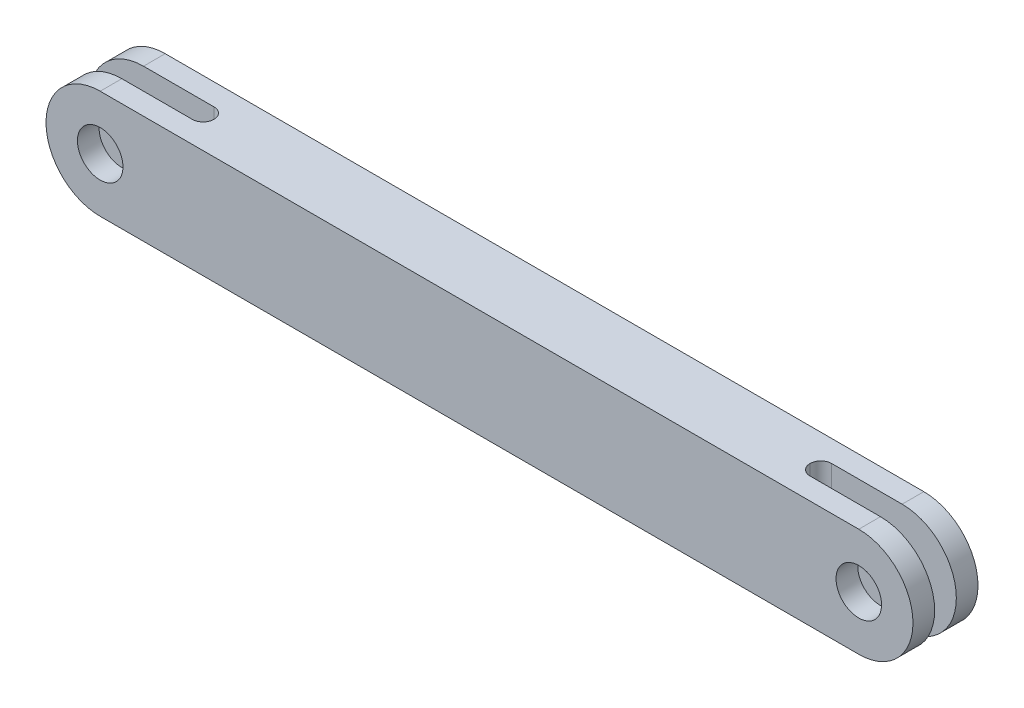
ISO-10303-21;
HEADER;
FILE_DESCRIPTION(('STEP AP214'),'2;1');
FILE_NAME('part.step','',(''),(''),'','','');
FILE_SCHEMA(('AUTOMOTIVE_DESIGN { 1 0 10303 214 1 1 1 1 }'));
ENDSEC;
DATA;
#1=APPLICATION_CONTEXT('core data for automotive mechanical design processes');
#2=APPLICATION_PROTOCOL_DEFINITION('international standard','automotive_design',2000,#1);
#3=PRODUCT_CONTEXT('',#1,'mechanical');
#4=PRODUCT('Part','Part','',(#3));
#5=PRODUCT_RELATED_PRODUCT_CATEGORY('part','',(#4));
#6=PRODUCT_DEFINITION_FORMATION('','',#4);
#7=PRODUCT_DEFINITION_CONTEXT('part definition',#1,'design');
#8=PRODUCT_DEFINITION('design','',#6,#7);
#9=PRODUCT_DEFINITION_SHAPE('','',#8);
#10=(LENGTH_UNIT() NAMED_UNIT(*) SI_UNIT(.MILLI.,.METRE.));
#11=(NAMED_UNIT(*) PLANE_ANGLE_UNIT() SI_UNIT($,.RADIAN.));
#12=(NAMED_UNIT(*) SI_UNIT($,.STERADIAN.) SOLID_ANGLE_UNIT());
#13=UNCERTAINTY_MEASURE_WITH_UNIT(LENGTH_MEASURE(1.E-05),#10,'distance_accuracy_value','');
#14=(GEOMETRIC_REPRESENTATION_CONTEXT(3) GLOBAL_UNCERTAINTY_ASSIGNED_CONTEXT((#13)) GLOBAL_UNIT_ASSIGNED_CONTEXT((#10,
#11,#12)) REPRESENTATION_CONTEXT('',''));
#15=CARTESIAN_POINT('',(0.,0.,0.));
#16=DIRECTION('',(0.,0.,1.));
#17=DIRECTION('',(1.,0.,0.));
#18=AXIS2_PLACEMENT_3D('',#15,#16,#17);
#19=CARTESIAN_POINT('',(0.,-4.99999999999999,6.));
#20=DIRECTION('',(0.,1.,0.));
#21=DIRECTION('',(-1.,0.,0.));
#22=AXIS2_PLACEMENT_3D('',#19,#20,#21);
#23=PLANE('',#22);
#24=DIRECTION('',(1.,0.,0.));
#25=VECTOR('',#24,1.);
#26=CARTESIAN_POINT('',(0.,-4.99999999999999,2.));
#27=LINE('',#26,#25);
#28=CARTESIAN_POINT('',(28.5,-4.99999999999999,2.));
#29=VERTEX_POINT('',#28);
#30=CARTESIAN_POINT('',(35.,-5.,2.));
#31=VERTEX_POINT('',#30);
#32=EDGE_CURVE('E197',#29,#31,#27,.T.);
#33=ORIENTED_EDGE('',*,*,#32,.F.);
#34=CARTESIAN_POINT('',(28.5,-4.99999999999999,3.));
#35=DIRECTION('',(0.,1.,0.));
#36=DIRECTION('',(-1.,0.,0.));
#37=AXIS2_PLACEMENT_3D('',#34,#35,#36);
#38=CIRCLE('',#37,1.);
#39=CARTESIAN_POINT('',(27.5,-4.99999999999999,3.));
#40=VERTEX_POINT('',#39);
#41=EDGE_CURVE('E48',#29,#40,#38,.T.);
#42=ORIENTED_EDGE('',*,*,#41,.T.);
#43=CARTESIAN_POINT('',(28.5,-4.99999999999999,3.));
#44=DIRECTION('',(0.,1.,0.));
#45=DIRECTION('',(-1.,0.,0.));
#46=AXIS2_PLACEMENT_3D('',#43,#44,#45);
#47=CIRCLE('',#46,1.);
#48=CARTESIAN_POINT('',(28.5,-4.99999999999999,4.));
#49=VERTEX_POINT('',#48);
#50=EDGE_CURVE('E246',#40,#49,#47,.T.);
#51=ORIENTED_EDGE('',*,*,#50,.T.);
#52=DIRECTION('',(1.,0.,0.));
#53=VECTOR('',#52,1.);
#54=CARTESIAN_POINT('',(0.,-4.99999999999999,4.));
#55=LINE('',#54,#53);
#56=CARTESIAN_POINT('',(35.,-5.,4.));
#57=VERTEX_POINT('',#56);
#58=EDGE_CURVE('E294',#49,#57,#55,.T.);
#59=ORIENTED_EDGE('',*,*,#58,.T.);
#60=DIRECTION('',(0.,0.,1.));
#61=VECTOR('',#60,1.);
#62=CARTESIAN_POINT('',(35.,-4.99999999999999,0.));
#63=LINE('',#62,#61);
#64=CARTESIAN_POINT('',(35.,-4.99999999999999,6.));
#65=VERTEX_POINT('',#64);
#66=EDGE_CURVE('E168',#57,#65,#63,.T.);
#67=ORIENTED_EDGE('',*,*,#66,.T.);
#68=DIRECTION('',(1.,0.,0.));
#69=VECTOR('',#68,1.);
#70=CARTESIAN_POINT('',(0.,-4.99999999999999,6.));
#71=LINE('',#70,#69);
#72=CARTESIAN_POINT('',(-35.,-5.,6.));
#73=VERTEX_POINT('',#72);
#74=EDGE_CURVE('E300',#73,#65,#71,.T.);
#75=ORIENTED_EDGE('',*,*,#74,.F.);
#76=DIRECTION('',(0.,0.,1.));
#77=VECTOR('',#76,1.);
#78=CARTESIAN_POINT('',(-35.,-5.,0.));
#79=LINE('',#78,#77);
#80=CARTESIAN_POINT('',(-35.,-5.00000000000001,4.));
#81=VERTEX_POINT('',#80);
#82=EDGE_CURVE('E165',#81,#73,#79,.T.);
#83=ORIENTED_EDGE('',*,*,#82,.F.);
#84=DIRECTION('',(1.,0.,0.));
#85=VECTOR('',#84,1.);
#86=CARTESIAN_POINT('',(0.,-4.99999999999999,4.));
#87=LINE('',#86,#85);
#88=CARTESIAN_POINT('',(-28.5,-5.,4.));
#89=VERTEX_POINT('',#88);
#90=EDGE_CURVE('E150',#81,#89,#87,.T.);
#91=ORIENTED_EDGE('',*,*,#90,.T.);
#92=CARTESIAN_POINT('',(-28.5,-5.,3.));
#93=DIRECTION('',(0.,1.,0.));
#94=DIRECTION('',(-1.,0.,0.));
#95=AXIS2_PLACEMENT_3D('',#92,#93,#94);
#96=CIRCLE('',#95,1.);
#97=CARTESIAN_POINT('',(-27.5,-5.,3.));
#98=VERTEX_POINT('',#97);
#99=EDGE_CURVE('E243',#89,#98,#96,.T.);
#100=ORIENTED_EDGE('',*,*,#99,.T.);
#101=CARTESIAN_POINT('',(-28.5,-5.,3.));
#102=DIRECTION('',(0.,1.,0.));
#103=DIRECTION('',(-1.,0.,0.));
#104=AXIS2_PLACEMENT_3D('',#101,#102,#103);
#105=CIRCLE('',#104,1.);
#106=CARTESIAN_POINT('',(-28.5,-5.,2.));
#107=VERTEX_POINT('',#106);
#108=EDGE_CURVE('E239',#98,#107,#105,.T.);
#109=ORIENTED_EDGE('',*,*,#108,.T.);
#110=DIRECTION('',(1.,0.,0.));
#111=VECTOR('',#110,1.);
#112=CARTESIAN_POINT('',(0.,-4.99999999999999,2.));
#113=LINE('',#112,#111);
#114=CARTESIAN_POINT('',(-35.,-5.00000000000001,2.));
#115=VERTEX_POINT('',#114);
#116=EDGE_CURVE('E187',#115,#107,#113,.T.);
#117=ORIENTED_EDGE('',*,*,#116,.F.);
#118=DIRECTION('',(0.,0.,-1.));
#119=VECTOR('',#118,1.);
#120=CARTESIAN_POINT('',(-35.,-5.,6.));
#121=LINE('',#120,#119);
#122=CARTESIAN_POINT('',(-35.,-5.,0.));
#123=VERTEX_POINT('',#122);
#124=EDGE_CURVE('E217',#115,#123,#121,.T.);
#125=ORIENTED_EDGE('',*,*,#124,.T.);
#126=DIRECTION('',(1.,0.,0.));
#127=VECTOR('',#126,1.);
#128=CARTESIAN_POINT('',(0.,-4.99999999999999,0.));
#129=LINE('',#128,#127);
#130=CARTESIAN_POINT('',(35.,-4.99999999999999,0.));
#131=VERTEX_POINT('',#130);
#132=EDGE_CURVE('E203',#123,#131,#129,.T.);
#133=ORIENTED_EDGE('',*,*,#132,.T.);
#134=DIRECTION('',(0.,0.,-1.));
#135=VECTOR('',#134,1.);
#136=CARTESIAN_POINT('',(35.,-4.99999999999999,6.));
#137=LINE('',#136,#135);
#138=EDGE_CURVE('E223',#31,#131,#137,.T.);
#139=ORIENTED_EDGE('',*,*,#138,.F.);
#140=EDGE_LOOP('',(#33,#42,#51,#59,#67,#75,#83,#91,#100,#109,#117,#125,#133,#139));
#141=FACE_BOUND('',#140,.T.);
#142=ADVANCED_FACE('F39',(#141),#23,.F.);
#143=CARTESIAN_POINT('',(0.,5.,6.));
#144=DIRECTION('',(0.,-1.,0.));
#145=DIRECTION('',(1.,0.,0.));
#146=AXIS2_PLACEMENT_3D('',#143,#144,#145);
#147=PLANE('',#146);
#148=CARTESIAN_POINT('',(-28.5,5.,3.));
#149=DIRECTION('',(0.,-1.,0.));
#150=DIRECTION('',(1.,0.,0.));
#151=AXIS2_PLACEMENT_3D('',#148,#149,#150);
#152=CIRCLE('',#151,1.);
#153=CARTESIAN_POINT('',(-28.5,5.,2.));
#154=VERTEX_POINT('',#153);
#155=CARTESIAN_POINT('',(-27.5,5.,3.));
#156=VERTEX_POINT('',#155);
#157=EDGE_CURVE('E241',#154,#156,#152,.T.);
#158=ORIENTED_EDGE('',*,*,#157,.T.);
#159=CARTESIAN_POINT('',(-28.5,5.,3.));
#160=DIRECTION('',(0.,-1.,0.));
#161=DIRECTION('',(1.,0.,0.));
#162=AXIS2_PLACEMENT_3D('',#159,#160,#161);
#163=CIRCLE('',#162,1.);
#164=CARTESIAN_POINT('',(-28.5,5.,4.));
#165=VERTEX_POINT('',#164);
#166=EDGE_CURVE('E147',#156,#165,#163,.T.);
#167=ORIENTED_EDGE('',*,*,#166,.T.);
#168=DIRECTION('',(-1.,0.,0.));
#169=VECTOR('',#168,1.);
#170=CARTESIAN_POINT('',(0.,5.,4.));
#171=LINE('',#170,#169);
#172=CARTESIAN_POINT('',(-35.,5.,4.));
#173=VERTEX_POINT('',#172);
#174=EDGE_CURVE('E140',#165,#173,#171,.T.);
#175=ORIENTED_EDGE('',*,*,#174,.T.);
#176=DIRECTION('',(0.,0.,1.));
#177=VECTOR('',#176,1.);
#178=CARTESIAN_POINT('',(-35.,5.,0.));
#179=LINE('',#178,#177);
#180=CARTESIAN_POINT('',(-35.,5.,6.));
#181=VERTEX_POINT('',#180);
#182=EDGE_CURVE('E145',#173,#181,#179,.T.);
#183=ORIENTED_EDGE('',*,*,#182,.T.);
#184=DIRECTION('',(-1.,0.,0.));
#185=VECTOR('',#184,1.);
#186=CARTESIAN_POINT('',(0.,5.,6.));
#187=LINE('',#186,#185);
#188=CARTESIAN_POINT('',(35.,5.,6.));
#189=VERTEX_POINT('',#188);
#190=EDGE_CURVE('E307',#189,#181,#187,.T.);
#191=ORIENTED_EDGE('',*,*,#190,.F.);
#192=DIRECTION('',(0.,0.,1.));
#193=VECTOR('',#192,1.);
#194=CARTESIAN_POINT('',(35.,5.,0.));
#195=LINE('',#194,#193);
#196=CARTESIAN_POINT('',(35.,5.00000000000001,4.));
#197=VERTEX_POINT('',#196);
#198=EDGE_CURVE('E164',#197,#189,#195,.T.);
#199=ORIENTED_EDGE('',*,*,#198,.F.);
#200=DIRECTION('',(-1.,0.,0.));
#201=VECTOR('',#200,1.);
#202=CARTESIAN_POINT('',(0.,5.,4.));
#203=LINE('',#202,#201);
#204=CARTESIAN_POINT('',(28.5,5.00000000000001,4.));
#205=VERTEX_POINT('',#204);
#206=EDGE_CURVE('E182',#197,#205,#203,.T.);
#207=ORIENTED_EDGE('',*,*,#206,.T.);
#208=CARTESIAN_POINT('',(28.5,5.00000000000001,3.));
#209=DIRECTION('',(0.,-1.,0.));
#210=DIRECTION('',(1.,0.,0.));
#211=AXIS2_PLACEMENT_3D('',#208,#209,#210);
#212=CIRCLE('',#211,1.);
#213=CARTESIAN_POINT('',(27.5,5.00000000000001,3.));
#214=VERTEX_POINT('',#213);
#215=EDGE_CURVE('E55',#205,#214,#212,.T.);
#216=ORIENTED_EDGE('',*,*,#215,.T.);
#217=CARTESIAN_POINT('',(28.5,5.00000000000001,3.));
#218=DIRECTION('',(0.,-1.,0.));
#219=DIRECTION('',(1.,0.,0.));
#220=AXIS2_PLACEMENT_3D('',#217,#218,#219);
#221=CIRCLE('',#220,1.);
#222=CARTESIAN_POINT('',(28.5,5.00000000000001,2.));
#223=VERTEX_POINT('',#222);
#224=EDGE_CURVE('E12',#214,#223,#221,.T.);
#225=ORIENTED_EDGE('',*,*,#224,.T.);
#226=DIRECTION('',(-1.,0.,0.));
#227=VECTOR('',#226,1.);
#228=CARTESIAN_POINT('',(0.,5.,2.));
#229=LINE('',#228,#227);
#230=CARTESIAN_POINT('',(35.,5.00000000000001,2.));
#231=VERTEX_POINT('',#230);
#232=EDGE_CURVE('E191',#231,#223,#229,.T.);
#233=ORIENTED_EDGE('',*,*,#232,.F.);
#234=DIRECTION('',(0.,0.,-1.));
#235=VECTOR('',#234,1.);
#236=CARTESIAN_POINT('',(35.,5.,6.));
#237=LINE('',#236,#235);
#238=CARTESIAN_POINT('',(35.,5.,0.));
#239=VERTEX_POINT('',#238);
#240=EDGE_CURVE('E221',#231,#239,#237,.T.);
#241=ORIENTED_EDGE('',*,*,#240,.T.);
#242=DIRECTION('',(-1.,0.,0.));
#243=VECTOR('',#242,1.);
#244=CARTESIAN_POINT('',(0.,5.,0.));
#245=LINE('',#244,#243);
#246=CARTESIAN_POINT('',(-35.,5.,0.));
#247=VERTEX_POINT('',#246);
#248=EDGE_CURVE('E211',#239,#247,#245,.T.);
#249=ORIENTED_EDGE('',*,*,#248,.T.);
#250=DIRECTION('',(0.,0.,-1.));
#251=VECTOR('',#250,1.);
#252=CARTESIAN_POINT('',(-35.,5.,6.));
#253=LINE('',#252,#251);
#254=CARTESIAN_POINT('',(-35.,5.,2.));
#255=VERTEX_POINT('',#254);
#256=EDGE_CURVE('E219',#255,#247,#253,.T.);
#257=ORIENTED_EDGE('',*,*,#256,.F.);
#258=DIRECTION('',(-1.,0.,0.));
#259=VECTOR('',#258,1.);
#260=CARTESIAN_POINT('',(0.,5.,2.));
#261=LINE('',#260,#259);
#262=EDGE_CURVE('E185',#154,#255,#261,.T.);
#263=ORIENTED_EDGE('',*,*,#262,.F.);
#264=EDGE_LOOP('',(#158,#167,#175,#183,#191,#199,#207,#216,#225,#233,#241,#249,#257,#263));
#265=FACE_BOUND('',#264,.T.);
#266=ADVANCED_FACE('F142',(#265),#147,.F.);
#267=CARTESIAN_POINT('',(35.,0.,6.));
#268=DIRECTION('',(0.,0.,-1.));
#269=DIRECTION('',(-1.,0.,0.));
#270=AXIS2_PLACEMENT_3D('',#267,#268,#269);
#271=CYLINDRICAL_SURFACE('',#270,5.);
#272=ORIENTED_EDGE('',*,*,#240,.F.);
#273=CARTESIAN_POINT('',(35.,0.,2.));
#274=DIRECTION('',(0.,0.,1.));
#275=DIRECTION('',(1.,0.,0.));
#276=AXIS2_PLACEMENT_3D('',#273,#274,#275);
#277=CIRCLE('',#276,5.);
#278=EDGE_CURVE('E194',#231,#31,#277,.F.);
#279=ORIENTED_EDGE('',*,*,#278,.T.);
#280=ORIENTED_EDGE('',*,*,#138,.T.);
#281=CARTESIAN_POINT('',(35.,0.,0.));
#282=DIRECTION('',(0.,0.,1.));
#283=DIRECTION('',(1.,0.,0.));
#284=AXIS2_PLACEMENT_3D('',#281,#282,#283);
#285=CIRCLE('',#284,5.);
#286=EDGE_CURVE('E208',#239,#131,#285,.F.);
#287=ORIENTED_EDGE('',*,*,#286,.F.);
#288=EDGE_LOOP('',(#272,#279,#280,#287));
#289=FACE_BOUND('',#288,.T.);
#290=ADVANCED_FACE('F266',(#289),#271,.T.);
#291=CARTESIAN_POINT('',(-35.,0.,6.));
#292=DIRECTION('',(0.,0.,-1.));
#293=DIRECTION('',(-1.,0.,0.));
#294=AXIS2_PLACEMENT_3D('',#291,#292,#293);
#295=CYLINDRICAL_SURFACE('',#294,5.);
#296=CARTESIAN_POINT('',(-35.,0.,2.));
#297=DIRECTION('',(0.,0.,1.));
#298=DIRECTION('',(1.,0.,0.));
#299=AXIS2_PLACEMENT_3D('',#296,#297,#298);
#300=CIRCLE('',#299,5.);
#301=EDGE_CURVE('E183',#255,#115,#300,.T.);
#302=ORIENTED_EDGE('',*,*,#301,.F.);
#303=ORIENTED_EDGE('',*,*,#256,.T.);
#304=CARTESIAN_POINT('',(-35.,0.,0.));
#305=DIRECTION('',(0.,0.,1.));
#306=DIRECTION('',(1.,0.,0.));
#307=AXIS2_PLACEMENT_3D('',#304,#305,#306);
#308=CIRCLE('',#307,5.);
#309=EDGE_CURVE('E214',#247,#123,#308,.T.);
#310=ORIENTED_EDGE('',*,*,#309,.T.);
#311=ORIENTED_EDGE('',*,*,#124,.F.);
#312=EDGE_LOOP('',(#302,#303,#310,#311));
#313=FACE_BOUND('',#312,.T.);
#314=ADVANCED_FACE('F279',(#313),#295,.T.);
#315=CARTESIAN_POINT('',(35.,0.,0.));
#316=DIRECTION('',(0.,0.,1.));
#317=DIRECTION('',(1.,0.,0.));
#318=AXIS2_PLACEMENT_3D('',#315,#316,#317);
#319=CYLINDRICAL_SURFACE('',#318,2.1);
#320=CARTESIAN_POINT('',(35.,0.,0.));
#321=DIRECTION('',(0.,0.,1.));
#322=DIRECTION('',(-1.,0.,0.));
#323=AXIS2_PLACEMENT_3D('',#320,#321,#322);
#324=CIRCLE('',#323,2.1);
#325=CARTESIAN_POINT('',(32.9,0.,0.));
#326=VERTEX_POINT('',#325);
#327=EDGE_CURVE('E199',#326,#326,#324,.T.);
#328=ORIENTED_EDGE('',*,*,#327,.F.);
#329=EDGE_LOOP('',(#328));
#330=FACE_BOUND('',#329,.T.);
#331=CARTESIAN_POINT('',(35.,0.,2.));
#332=DIRECTION('',(0.,0.,1.));
#333=DIRECTION('',(1.,0.,0.));
#334=AXIS2_PLACEMENT_3D('',#331,#332,#333);
#335=CIRCLE('',#334,2.1);
#336=CARTESIAN_POINT('',(37.1,0.,2.));
#337=VERTEX_POINT('',#336);
#338=EDGE_CURVE('E190',#337,#337,#335,.F.);
#339=ORIENTED_EDGE('',*,*,#338,.F.);
#340=EDGE_LOOP('',(#339));
#341=FACE_BOUND('',#340,.T.);
#342=ADVANCED_FACE('F448',(#330,#341),#319,.F.);
#343=CARTESIAN_POINT('',(-35.,0.,0.));
#344=DIRECTION('',(0.,0.,1.));
#345=DIRECTION('',(1.,0.,0.));
#346=AXIS2_PLACEMENT_3D('',#343,#344,#345);
#347=CYLINDRICAL_SURFACE('',#346,2.1);
#348=CARTESIAN_POINT('',(-35.,0.,0.));
#349=DIRECTION('',(0.,0.,1.));
#350=DIRECTION('',(1.,0.,0.));
#351=AXIS2_PLACEMENT_3D('',#348,#349,#350);
#352=CIRCLE('',#351,2.1);
#353=CARTESIAN_POINT('',(-32.9,0.,0.));
#354=VERTEX_POINT('',#353);
#355=EDGE_CURVE('E200',#354,#354,#352,.T.);
#356=ORIENTED_EDGE('',*,*,#355,.F.);
#357=EDGE_LOOP('',(#356));
#358=FACE_BOUND('',#357,.T.);
#359=CARTESIAN_POINT('',(-35.,0.,2.));
#360=DIRECTION('',(0.,0.,1.));
#361=DIRECTION('',(1.,0.,0.));
#362=AXIS2_PLACEMENT_3D('',#359,#360,#361);
#363=CIRCLE('',#362,2.1);
#364=CARTESIAN_POINT('',(-32.9,0.,2.));
#365=VERTEX_POINT('',#364);
#366=EDGE_CURVE('E175',#365,#365,#363,.F.);
#367=ORIENTED_EDGE('',*,*,#366,.F.);
#368=EDGE_LOOP('',(#367));
#369=FACE_BOUND('',#368,.T.);
#370=ADVANCED_FACE('F452',(#358,#369),#347,.F.);
#371=CARTESIAN_POINT('',(0.,0.,0.));
#372=DIRECTION('',(0.,0.,1.));
#373=DIRECTION('',(1.,0.,0.));
#374=AXIS2_PLACEMENT_3D('',#371,#372,#373);
#375=PLANE('',#374);
#376=ORIENTED_EDGE('',*,*,#355,.T.);
#377=EDGE_LOOP('',(#376));
#378=FACE_BOUND('',#377,.T.);
#379=ORIENTED_EDGE('',*,*,#327,.T.);
#380=EDGE_LOOP('',(#379));
#381=FACE_BOUND('',#380,.T.);
#382=ORIENTED_EDGE('',*,*,#132,.F.);
#383=ORIENTED_EDGE('',*,*,#309,.F.);
#384=ORIENTED_EDGE('',*,*,#248,.F.);
#385=ORIENTED_EDGE('',*,*,#286,.T.);
#386=EDGE_LOOP('',(#382,#383,#384,#385));
#387=FACE_BOUND('',#386,.T.);
#388=ADVANCED_FACE('F274',(#378,#381,#387),#375,.F.);
#389=CARTESIAN_POINT('',(-52.5,10.,2.));
#390=DIRECTION('',(0.,0.,1.));
#391=DIRECTION('',(1.,0.,0.));
#392=AXIS2_PLACEMENT_3D('',#389,#390,#391);
#393=PLANE('',#392);
#394=ORIENTED_EDGE('',*,*,#366,.T.);
#395=EDGE_LOOP('',(#394));
#396=FACE_BOUND('',#395,.T.);
#397=ORIENTED_EDGE('',*,*,#116,.T.);
#398=DIRECTION('',(0.,-1.,0.));
#399=VECTOR('',#398,1.);
#400=CARTESIAN_POINT('',(-28.5,5.,2.));
#401=LINE('',#400,#399);
#402=EDGE_CURVE('E225',#107,#154,#401,.F.);
#403=ORIENTED_EDGE('',*,*,#402,.T.);
#404=ORIENTED_EDGE('',*,*,#262,.T.);
#405=ORIENTED_EDGE('',*,*,#301,.T.);
#406=EDGE_LOOP('',(#397,#403,#404,#405));
#407=FACE_BOUND('',#406,.T.);
#408=ADVANCED_FACE('F281',(#396,#407),#393,.T.);
#409=CARTESIAN_POINT('',(52.5,10.,2.));
#410=DIRECTION('',(0.,0.,1.));
#411=DIRECTION('',(1.,0.,0.));
#412=AXIS2_PLACEMENT_3D('',#409,#410,#411);
#413=PLANE('',#412);
#414=ORIENTED_EDGE('',*,*,#338,.T.);
#415=EDGE_LOOP('',(#414));
#416=FACE_BOUND('',#415,.T.);
#417=ORIENTED_EDGE('',*,*,#232,.T.);
#418=DIRECTION('',(0.,-1.,0.));
#419=VECTOR('',#418,1.);
#420=CARTESIAN_POINT('',(28.5,-4.99999999999999,2.));
#421=LINE('',#420,#419);
#422=EDGE_CURVE('E237',#223,#29,#421,.T.);
#423=ORIENTED_EDGE('',*,*,#422,.T.);
#424=ORIENTED_EDGE('',*,*,#32,.T.);
#425=ORIENTED_EDGE('',*,*,#278,.F.);
#426=EDGE_LOOP('',(#417,#423,#424,#425));
#427=FACE_BOUND('',#426,.T.);
#428=ADVANCED_FACE('F263',(#416,#427),#413,.T.);
#429=CARTESIAN_POINT('',(35.,0.,0.));
#430=DIRECTION('',(0.,0.,1.));
#431=DIRECTION('',(-1.,0.,0.));
#432=AXIS2_PLACEMENT_3D('',#429,#430,#431);
#433=CYLINDRICAL_SURFACE('',#432,5.);
#434=ORIENTED_EDGE('',*,*,#198,.T.);
#435=CARTESIAN_POINT('',(35.,0.,6.));
#436=DIRECTION('',(0.,0.,1.));
#437=DIRECTION('',(1.,0.,0.));
#438=AXIS2_PLACEMENT_3D('',#435,#436,#437);
#439=CIRCLE('',#438,5.);
#440=EDGE_CURVE('E305',#189,#65,#439,.F.);
#441=ORIENTED_EDGE('',*,*,#440,.T.);
#442=ORIENTED_EDGE('',*,*,#66,.F.);
#443=CARTESIAN_POINT('',(35.,0.,4.));
#444=DIRECTION('',(0.,0.,1.));
#445=DIRECTION('',(1.,0.,0.));
#446=AXIS2_PLACEMENT_3D('',#443,#444,#445);
#447=CIRCLE('',#446,5.);
#448=EDGE_CURVE('E291',#197,#57,#447,.F.);
#449=ORIENTED_EDGE('',*,*,#448,.F.);
#450=EDGE_LOOP('',(#434,#441,#442,#449));
#451=FACE_BOUND('',#450,.T.);
#452=ADVANCED_FACE('F313',(#451),#433,.T.);
#453=CARTESIAN_POINT('',(-35.,0.,0.));
#454=DIRECTION('',(0.,0.,1.));
#455=DIRECTION('',(-1.,0.,0.));
#456=AXIS2_PLACEMENT_3D('',#453,#454,#455);
#457=CYLINDRICAL_SURFACE('',#456,5.);
#458=CARTESIAN_POINT('',(-35.,0.,4.));
#459=DIRECTION('',(0.,0.,1.));
#460=DIRECTION('',(1.,0.,0.));
#461=AXIS2_PLACEMENT_3D('',#458,#459,#460);
#462=CIRCLE('',#461,5.);
#463=EDGE_CURVE('E151',#173,#81,#462,.T.);
#464=ORIENTED_EDGE('',*,*,#463,.T.);
#465=ORIENTED_EDGE('',*,*,#82,.T.);
#466=CARTESIAN_POINT('',(-35.,0.,6.));
#467=DIRECTION('',(0.,0.,1.));
#468=DIRECTION('',(1.,0.,0.));
#469=AXIS2_PLACEMENT_3D('',#466,#467,#468);
#470=CIRCLE('',#469,5.);
#471=EDGE_CURVE('E162',#181,#73,#470,.T.);
#472=ORIENTED_EDGE('',*,*,#471,.F.);
#473=ORIENTED_EDGE('',*,*,#182,.F.);
#474=EDGE_LOOP('',(#464,#465,#472,#473));
#475=FACE_BOUND('',#474,.T.);
#476=ADVANCED_FACE('F161',(#475),#457,.T.);
#477=CARTESIAN_POINT('',(35.,0.,6.));
#478=DIRECTION('',(0.,0.,-1.));
#479=DIRECTION('',(1.,0.,0.));
#480=AXIS2_PLACEMENT_3D('',#477,#478,#479);
#481=CYLINDRICAL_SURFACE('',#480,2.1);
#482=CARTESIAN_POINT('',(35.,0.,6.));
#483=DIRECTION('',(0.,0.,1.));
#484=DIRECTION('',(-1.,0.,0.));
#485=AXIS2_PLACEMENT_3D('',#482,#483,#484);
#486=CIRCLE('',#485,2.1);
#487=CARTESIAN_POINT('',(32.9,0.,6.));
#488=VERTEX_POINT('',#487);
#489=EDGE_CURVE('E296',#488,#488,#486,.T.);
#490=ORIENTED_EDGE('',*,*,#489,.T.);
#491=EDGE_LOOP('',(#490));
#492=FACE_BOUND('',#491,.T.);
#493=CARTESIAN_POINT('',(35.,0.,4.));
#494=DIRECTION('',(0.,0.,1.));
#495=DIRECTION('',(1.,0.,0.));
#496=AXIS2_PLACEMENT_3D('',#493,#494,#495);
#497=CIRCLE('',#496,2.1);
#498=CARTESIAN_POINT('',(37.1,0.,4.));
#499=VERTEX_POINT('',#498);
#500=EDGE_CURVE('E179',#499,#499,#497,.F.);
#501=ORIENTED_EDGE('',*,*,#500,.T.);
#502=EDGE_LOOP('',(#501));
#503=FACE_BOUND('',#502,.T.);
#504=ADVANCED_FACE('F419',(#492,#503),#481,.F.);
#505=CARTESIAN_POINT('',(-35.,0.,6.));
#506=DIRECTION('',(0.,0.,-1.));
#507=DIRECTION('',(1.,0.,0.));
#508=AXIS2_PLACEMENT_3D('',#505,#506,#507);
#509=CYLINDRICAL_SURFACE('',#508,2.1);
#510=CARTESIAN_POINT('',(-35.,0.,6.));
#511=DIRECTION('',(0.,0.,1.));
#512=DIRECTION('',(1.,0.,0.));
#513=AXIS2_PLACEMENT_3D('',#510,#511,#512);
#514=CIRCLE('',#513,2.1);
#515=CARTESIAN_POINT('',(-32.9,0.,6.));
#516=VERTEX_POINT('',#515);
#517=EDGE_CURVE('E297',#516,#516,#514,.T.);
#518=ORIENTED_EDGE('',*,*,#517,.T.);
#519=EDGE_LOOP('',(#518));
#520=FACE_BOUND('',#519,.T.);
#521=CARTESIAN_POINT('',(-35.,0.,4.));
#522=DIRECTION('',(0.,0.,1.));
#523=DIRECTION('',(1.,0.,0.));
#524=AXIS2_PLACEMENT_3D('',#521,#522,#523);
#525=CIRCLE('',#524,2.1);
#526=CARTESIAN_POINT('',(-32.9,0.,4.));
#527=VERTEX_POINT('',#526);
#528=EDGE_CURVE('E159',#527,#527,#525,.F.);
#529=ORIENTED_EDGE('',*,*,#528,.T.);
#530=EDGE_LOOP('',(#529));
#531=FACE_BOUND('',#530,.T.);
#532=ADVANCED_FACE('F408',(#520,#531),#509,.F.);
#533=CARTESIAN_POINT('',(0.,0.,6.));
#534=DIRECTION('',(0.,0.,-1.));
#535=DIRECTION('',(1.,0.,0.));
#536=AXIS2_PLACEMENT_3D('',#533,#534,#535);
#537=PLANE('',#536);
#538=ORIENTED_EDGE('',*,*,#517,.F.);
#539=EDGE_LOOP('',(#538));
#540=FACE_BOUND('',#539,.T.);
#541=ORIENTED_EDGE('',*,*,#489,.F.);
#542=EDGE_LOOP('',(#541));
#543=FACE_BOUND('',#542,.T.);
#544=ORIENTED_EDGE('',*,*,#74,.T.);
#545=ORIENTED_EDGE('',*,*,#440,.F.);
#546=ORIENTED_EDGE('',*,*,#190,.T.);
#547=ORIENTED_EDGE('',*,*,#471,.T.);
#548=EDGE_LOOP('',(#544,#545,#546,#547));
#549=FACE_BOUND('',#548,.T.);
#550=ADVANCED_FACE('F309',(#540,#543,#549),#537,.F.);
#551=CARTESIAN_POINT('',(-52.5,10.,4.));
#552=DIRECTION('',(0.,0.,-1.));
#553=DIRECTION('',(1.,0.,0.));
#554=AXIS2_PLACEMENT_3D('',#551,#552,#553);
#555=PLANE('',#554);
#556=ORIENTED_EDGE('',*,*,#528,.F.);
#557=EDGE_LOOP('',(#556));
#558=FACE_BOUND('',#557,.T.);
#559=ORIENTED_EDGE('',*,*,#174,.F.);
#560=DIRECTION('',(0.,-1.,0.));
#561=VECTOR('',#560,1.);
#562=CARTESIAN_POINT('',(-28.5,-5.,4.));
#563=LINE('',#562,#561);
#564=EDGE_CURVE('E232',#165,#89,#563,.T.);
#565=ORIENTED_EDGE('',*,*,#564,.T.);
#566=ORIENTED_EDGE('',*,*,#90,.F.);
#567=ORIENTED_EDGE('',*,*,#463,.F.);
#568=EDGE_LOOP('',(#559,#565,#566,#567));
#569=FACE_BOUND('',#568,.T.);
#570=ADVANCED_FACE('F154',(#558,#569),#555,.T.);
#571=CARTESIAN_POINT('',(52.5,10.,4.));
#572=DIRECTION('',(0.,0.,-1.));
#573=DIRECTION('',(1.,0.,0.));
#574=AXIS2_PLACEMENT_3D('',#571,#572,#573);
#575=PLANE('',#574);
#576=ORIENTED_EDGE('',*,*,#500,.F.);
#577=EDGE_LOOP('',(#576));
#578=FACE_BOUND('',#577,.T.);
#579=ORIENTED_EDGE('',*,*,#58,.F.);
#580=DIRECTION('',(0.,-1.,0.));
#581=VECTOR('',#580,1.);
#582=CARTESIAN_POINT('',(28.5,5.00000000000001,4.));
#583=LINE('',#582,#581);
#584=EDGE_CURVE('E234',#49,#205,#583,.F.);
#585=ORIENTED_EDGE('',*,*,#584,.T.);
#586=ORIENTED_EDGE('',*,*,#206,.F.);
#587=ORIENTED_EDGE('',*,*,#448,.T.);
#588=EDGE_LOOP('',(#579,#585,#586,#587));
#589=FACE_BOUND('',#588,.T.);
#590=ADVANCED_FACE('F317',(#578,#589),#575,.T.);
#591=CARTESIAN_POINT('',(-28.5,10.,3.));
#592=DIRECTION('',(0.,1.,0.));
#593=DIRECTION('',(0.,0.,1.));
#594=AXIS2_PLACEMENT_3D('',#591,#592,#593);
#595=CYLINDRICAL_SURFACE('',#594,1.);
#596=ORIENTED_EDGE('',*,*,#564,.F.);
#597=ORIENTED_EDGE('',*,*,#166,.F.);
#598=DIRECTION('',(0.,-1.,0.));
#599=VECTOR('',#598,1.);
#600=CARTESIAN_POINT('',(-27.5,5.,3.));
#601=LINE('',#600,#599);
#602=EDGE_CURVE('E178',#98,#156,#601,.F.);
#603=ORIENTED_EDGE('',*,*,#602,.F.);
#604=ORIENTED_EDGE('',*,*,#99,.F.);
#605=EDGE_LOOP('',(#596,#597,#603,#604));
#606=FACE_BOUND('',#605,.T.);
#607=ADVANCED_FACE('F286',(#606),#595,.F.);
#608=CARTESIAN_POINT('',(-28.5,10.,3.));
#609=DIRECTION('',(0.,1.,0.));
#610=DIRECTION('',(0.,0.,1.));
#611=AXIS2_PLACEMENT_3D('',#608,#609,#610);
#612=CYLINDRICAL_SURFACE('',#611,1.);
#613=ORIENTED_EDGE('',*,*,#157,.F.);
#614=ORIENTED_EDGE('',*,*,#402,.F.);
#615=ORIENTED_EDGE('',*,*,#108,.F.);
#616=ORIENTED_EDGE('',*,*,#602,.T.);
#617=EDGE_LOOP('',(#613,#614,#615,#616));
#618=FACE_BOUND('',#617,.T.);
#619=ADVANCED_FACE('F284',(#618),#612,.F.);
#620=CARTESIAN_POINT('',(28.5,10.,3.));
#621=DIRECTION('',(0.,1.,0.));
#622=DIRECTION('',(0.,0.,1.));
#623=AXIS2_PLACEMENT_3D('',#620,#621,#622);
#624=CYLINDRICAL_SURFACE('',#623,1.);
#625=ORIENTED_EDGE('',*,*,#422,.F.);
#626=ORIENTED_EDGE('',*,*,#224,.F.);
#627=DIRECTION('',(0.,-1.,0.));
#628=VECTOR('',#627,1.);
#629=CARTESIAN_POINT('',(27.5,5.00000000000001,3.));
#630=LINE('',#629,#628);
#631=EDGE_CURVE('E43',#40,#214,#630,.F.);
#632=ORIENTED_EDGE('',*,*,#631,.F.);
#633=ORIENTED_EDGE('',*,*,#41,.F.);
#634=EDGE_LOOP('',(#625,#626,#632,#633));
#635=FACE_BOUND('',#634,.T.);
#636=ADVANCED_FACE('F41',(#635),#624,.F.);
#637=CARTESIAN_POINT('',(28.5,10.,3.));
#638=DIRECTION('',(0.,1.,0.));
#639=DIRECTION('',(0.,0.,1.));
#640=AXIS2_PLACEMENT_3D('',#637,#638,#639);
#641=CYLINDRICAL_SURFACE('',#640,1.);
#642=ORIENTED_EDGE('',*,*,#215,.F.);
#643=ORIENTED_EDGE('',*,*,#584,.F.);
#644=ORIENTED_EDGE('',*,*,#50,.F.);
#645=ORIENTED_EDGE('',*,*,#631,.T.);
#646=EDGE_LOOP('',(#642,#643,#644,#645));
#647=FACE_BOUND('',#646,.T.);
#648=ADVANCED_FACE('F256',(#647),#641,.F.);
#649=CLOSED_SHELL('',(#142,#266,#290,#314,#342,#370,#388,#408,#428,#452,#476,#504,#532,#550,
#570,#590,#607,#619,#636,#648));
#650=MANIFOLD_SOLID_BREP('B2',#649);
#651=ADVANCED_BREP_SHAPE_REPRESENTATION('',(#18,#650),#14);
#652=SHAPE_DEFINITION_REPRESENTATION(#9,#651);
ENDSEC;
END-ISO-10303-21;
